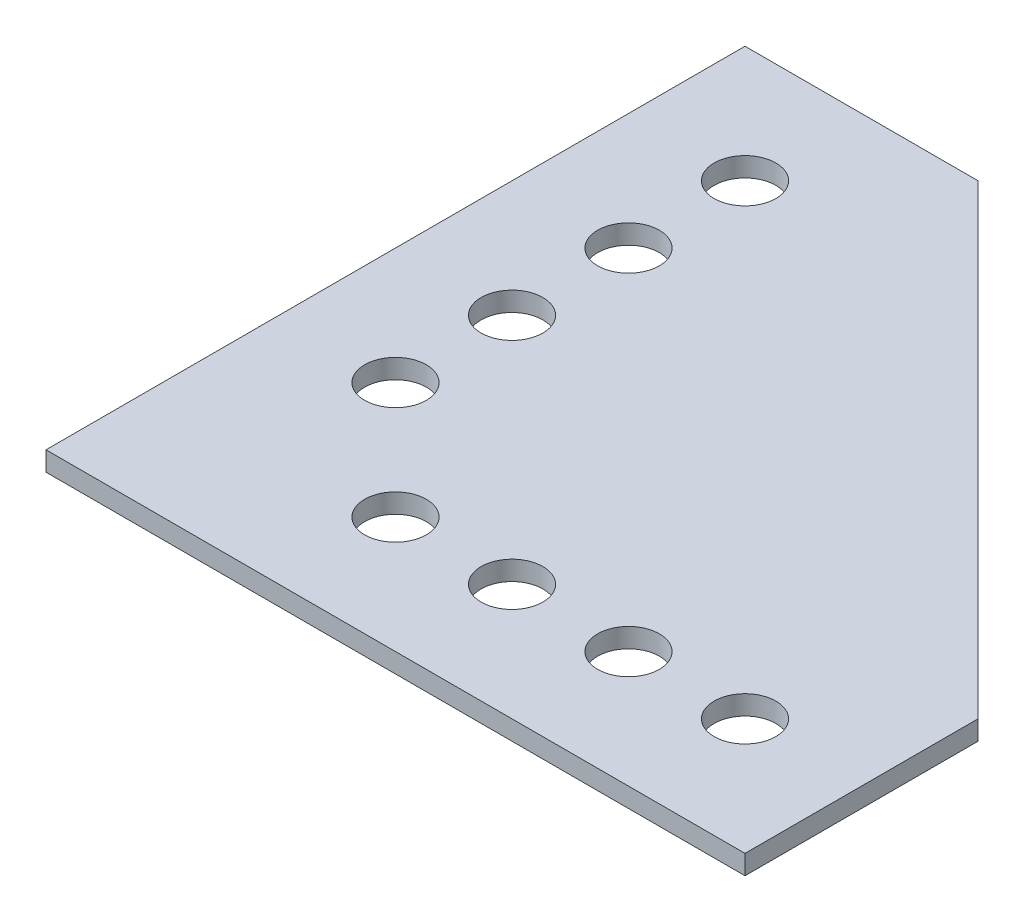
ISO-10303-21;
HEADER;
FILE_DESCRIPTION(('STEP AP214'),'2;1');
FILE_NAME('part.step','',(''),(''),'','','');
FILE_SCHEMA(('AUTOMOTIVE_DESIGN { 1 0 10303 214 1 1 1 1 }'));
ENDSEC;
DATA;
#1=APPLICATION_CONTEXT('core data for automotive mechanical design processes');
#2=APPLICATION_PROTOCOL_DEFINITION('international standard','automotive_design',2000,#1);
#3=PRODUCT_CONTEXT('',#1,'mechanical');
#4=PRODUCT('Part','Part','',(#3));
#5=PRODUCT_RELATED_PRODUCT_CATEGORY('part','',(#4));
#6=PRODUCT_DEFINITION_FORMATION('','',#4);
#7=PRODUCT_DEFINITION_CONTEXT('part definition',#1,'design');
#8=PRODUCT_DEFINITION('design','',#6,#7);
#9=PRODUCT_DEFINITION_SHAPE('','',#8);
#10=(LENGTH_UNIT() NAMED_UNIT(*) SI_UNIT(.MILLI.,.METRE.));
#11=(NAMED_UNIT(*) PLANE_ANGLE_UNIT() SI_UNIT($,.RADIAN.));
#12=(NAMED_UNIT(*) SI_UNIT($,.STERADIAN.) SOLID_ANGLE_UNIT());
#13=UNCERTAINTY_MEASURE_WITH_UNIT(LENGTH_MEASURE(1.E-05),#10,'distance_accuracy_value','');
#14=(GEOMETRIC_REPRESENTATION_CONTEXT(3) GLOBAL_UNCERTAINTY_ASSIGNED_CONTEXT((#13)) GLOBAL_UNIT_ASSIGNED_CONTEXT((#10,
#11,#12)) REPRESENTATION_CONTEXT('',''));
#15=CARTESIAN_POINT('',(0.,0.,0.));
#16=DIRECTION('',(0.,0.,1.));
#17=DIRECTION('',(1.,0.,0.));
#18=AXIS2_PLACEMENT_3D('',#15,#16,#17);
#19=CARTESIAN_POINT('',(0.,0.,0.));
#20=DIRECTION('',(0.,1.,0.));
#21=DIRECTION('',(0.,0.,1.));
#22=AXIS2_PLACEMENT_3D('',#19,#20,#21);
#23=PLANE('',#22);
#24=CARTESIAN_POINT('',(19.05,0.,38.1));
#25=DIRECTION('',(0.,1.,0.));
#26=DIRECTION('',(0.,0.,1.));
#27=AXIS2_PLACEMENT_3D('',#24,#25,#26);
#28=CIRCLE('',#27,5.0419);
#29=CARTESIAN_POINT('',(19.05,0.,43.1419));
#30=VERTEX_POINT('',#29);
#31=EDGE_CURVE('E189',#30,#30,#28,.F.);
#32=ORIENTED_EDGE('',*,*,#31,.F.);
#33=EDGE_LOOP('',(#32));
#34=FACE_BOUND('',#33,.T.);
#35=CARTESIAN_POINT('',(19.05,0.,57.15));
#36=DIRECTION('',(0.,1.,0.));
#37=DIRECTION('',(0.,0.,1.));
#38=AXIS2_PLACEMENT_3D('',#35,#36,#37);
#39=CIRCLE('',#38,5.0419);
#40=CARTESIAN_POINT('',(19.05,0.,62.1919));
#41=VERTEX_POINT('',#40);
#42=EDGE_CURVE('E195',#41,#41,#39,.F.);
#43=ORIENTED_EDGE('',*,*,#42,.F.);
#44=EDGE_LOOP('',(#43));
#45=FACE_BOUND('',#44,.T.);
#46=CARTESIAN_POINT('',(19.05,0.,76.2));
#47=DIRECTION('',(0.,1.,0.));
#48=DIRECTION('',(0.,0.,1.));
#49=AXIS2_PLACEMENT_3D('',#46,#47,#48);
#50=CIRCLE('',#49,5.0419);
#51=CARTESIAN_POINT('',(19.05,0.,81.2419));
#52=VERTEX_POINT('',#51);
#53=EDGE_CURVE('E201',#52,#52,#50,.F.);
#54=ORIENTED_EDGE('',*,*,#53,.F.);
#55=EDGE_LOOP('',(#54));
#56=FACE_BOUND('',#55,.T.);
#57=CARTESIAN_POINT('',(38.1,0.,95.25));
#58=DIRECTION('',(0.,1.,0.));
#59=DIRECTION('',(0.,0.,1.));
#60=AXIS2_PLACEMENT_3D('',#57,#58,#59);
#61=CIRCLE('',#60,5.0419);
#62=CARTESIAN_POINT('',(38.1,0.,100.2919));
#63=VERTEX_POINT('',#62);
#64=EDGE_CURVE('E207',#63,#63,#61,.F.);
#65=ORIENTED_EDGE('',*,*,#64,.F.);
#66=EDGE_LOOP('',(#65));
#67=FACE_BOUND('',#66,.T.);
#68=CARTESIAN_POINT('',(57.15,0.,95.25));
#69=DIRECTION('',(0.,1.,0.));
#70=DIRECTION('',(0.,0.,1.));
#71=AXIS2_PLACEMENT_3D('',#68,#69,#70);
#72=CIRCLE('',#71,5.0419);
#73=CARTESIAN_POINT('',(57.15,0.,100.2919));
#74=VERTEX_POINT('',#73);
#75=EDGE_CURVE('E213',#74,#74,#72,.F.);
#76=ORIENTED_EDGE('',*,*,#75,.F.);
#77=EDGE_LOOP('',(#76));
#78=FACE_BOUND('',#77,.T.);
#79=CARTESIAN_POINT('',(76.2,0.,95.25));
#80=DIRECTION('',(0.,1.,0.));
#81=DIRECTION('',(0.,0.,1.));
#82=AXIS2_PLACEMENT_3D('',#79,#80,#81);
#83=CIRCLE('',#82,5.0419);
#84=CARTESIAN_POINT('',(76.2,0.,100.2919));
#85=VERTEX_POINT('',#84);
#86=EDGE_CURVE('E219',#85,#85,#83,.F.);
#87=ORIENTED_EDGE('',*,*,#86,.F.);
#88=EDGE_LOOP('',(#87));
#89=FACE_BOUND('',#88,.T.);
#90=CARTESIAN_POINT('',(95.25,0.,95.25));
#91=DIRECTION('',(0.,1.,0.));
#92=DIRECTION('',(0.,0.,1.));
#93=AXIS2_PLACEMENT_3D('',#90,#91,#92);
#94=CIRCLE('',#93,5.0419);
#95=CARTESIAN_POINT('',(95.25,0.,100.2919));
#96=VERTEX_POINT('',#95);
#97=EDGE_CURVE('E112',#96,#96,#94,.F.);
#98=ORIENTED_EDGE('',*,*,#97,.F.);
#99=EDGE_LOOP('',(#98));
#100=FACE_BOUND('',#99,.T.);
#101=DIRECTION('',(0.,0.,1.));
#102=VECTOR('',#101,1.);
#103=CARTESIAN_POINT('',(0.,0.,0.));
#104=LINE('',#103,#102);
#105=CARTESIAN_POINT('',(0.,0.,0.));
#106=VERTEX_POINT('',#105);
#107=CARTESIAN_POINT('',(0.,0.,114.3));
#108=VERTEX_POINT('',#107);
#109=EDGE_CURVE('E108',#106,#108,#104,.T.);
#110=ORIENTED_EDGE('',*,*,#109,.F.);
#111=DIRECTION('',(-1.,0.,0.));
#112=VECTOR('',#111,1.);
#113=CARTESIAN_POINT('',(0.,0.,0.));
#114=LINE('',#113,#112);
#115=CARTESIAN_POINT('',(38.1,0.,0.));
#116=VERTEX_POINT('',#115);
#117=EDGE_CURVE('E76',#116,#106,#114,.T.);
#118=ORIENTED_EDGE('',*,*,#117,.F.);
#119=DIRECTION('',(-0.707106781186548,0.,-0.707106781186548));
#120=VECTOR('',#119,1.);
#121=CARTESIAN_POINT('',(114.3,0.,76.2));
#122=LINE('',#121,#120);
#123=CARTESIAN_POINT('',(114.3,0.,76.2));
#124=VERTEX_POINT('',#123);
#125=EDGE_CURVE('E70',#124,#116,#122,.T.);
#126=ORIENTED_EDGE('',*,*,#125,.F.);
#127=DIRECTION('',(0.,0.,-1.));
#128=VECTOR('',#127,1.);
#129=CARTESIAN_POINT('',(114.3,0.,114.3));
#130=LINE('',#129,#128);
#131=CARTESIAN_POINT('',(114.3,0.,114.3));
#132=VERTEX_POINT('',#131);
#133=EDGE_CURVE('E99',#132,#124,#130,.T.);
#134=ORIENTED_EDGE('',*,*,#133,.F.);
#135=DIRECTION('',(1.,0.,0.));
#136=VECTOR('',#135,1.);
#137=CARTESIAN_POINT('',(0.,0.,114.3));
#138=LINE('',#137,#136);
#139=EDGE_CURVE('E111',#108,#132,#138,.T.);
#140=ORIENTED_EDGE('',*,*,#139,.F.);
#141=EDGE_LOOP('',(#110,#118,#126,#134,#140));
#142=FACE_BOUND('',#141,.T.);
#143=CARTESIAN_POINT('',(19.05,0.,19.05));
#144=DIRECTION('',(0.,1.,0.));
#145=DIRECTION('',(0.,0.,1.));
#146=AXIS2_PLACEMENT_3D('',#143,#144,#145);
#147=CIRCLE('',#146,5.0419);
#148=CARTESIAN_POINT('',(19.05,0.,24.0919));
#149=VERTEX_POINT('',#148);
#150=EDGE_CURVE('E181',#149,#149,#147,.F.);
#151=ORIENTED_EDGE('',*,*,#150,.F.);
#152=EDGE_LOOP('',(#151));
#153=FACE_BOUND('',#152,.T.);
#154=ADVANCED_FACE('F33',(#34,#45,#56,#67,#78,#89,#100,#142,#153),#23,.F.);
#155=CARTESIAN_POINT('',(0.,3.175,0.));
#156=DIRECTION('',(1.,0.,0.));
#157=DIRECTION('',(0.,0.,-1.));
#158=AXIS2_PLACEMENT_3D('',#155,#156,#157);
#159=PLANE('',#158);
#160=ORIENTED_EDGE('',*,*,#109,.T.);
#161=DIRECTION('',(0.,-1.,0.));
#162=VECTOR('',#161,1.);
#163=CARTESIAN_POINT('',(0.,3.175,114.3));
#164=LINE('',#163,#162);
#165=CARTESIAN_POINT('',(0.,3.175,114.3));
#166=VERTEX_POINT('',#165);
#167=EDGE_CURVE('E11',#166,#108,#164,.T.);
#168=ORIENTED_EDGE('',*,*,#167,.F.);
#169=DIRECTION('',(0.,0.,1.));
#170=VECTOR('',#169,1.);
#171=CARTESIAN_POINT('',(0.,3.175,0.));
#172=LINE('',#171,#170);
#173=CARTESIAN_POINT('',(0.,3.175,0.));
#174=VERTEX_POINT('',#173);
#175=EDGE_CURVE('E117',#174,#166,#172,.T.);
#176=ORIENTED_EDGE('',*,*,#175,.F.);
#177=DIRECTION('',(0.,-1.,0.));
#178=VECTOR('',#177,1.);
#179=CARTESIAN_POINT('',(0.,3.175,0.));
#180=LINE('',#179,#178);
#181=EDGE_CURVE('E104',#174,#106,#180,.T.);
#182=ORIENTED_EDGE('',*,*,#181,.T.);
#183=EDGE_LOOP('',(#160,#168,#176,#182));
#184=FACE_BOUND('',#183,.T.);
#185=ADVANCED_FACE('F35',(#184),#159,.F.);
#186=CARTESIAN_POINT('',(0.,3.175,114.3));
#187=DIRECTION('',(0.,0.,-1.));
#188=DIRECTION('',(-1.,0.,0.));
#189=AXIS2_PLACEMENT_3D('',#186,#187,#188);
#190=PLANE('',#189);
#191=ORIENTED_EDGE('',*,*,#139,.T.);
#192=DIRECTION('',(0.,-1.,0.));
#193=VECTOR('',#192,1.);
#194=CARTESIAN_POINT('',(114.3,3.175,114.3));
#195=LINE('',#194,#193);
#196=CARTESIAN_POINT('',(114.3,3.175,114.3));
#197=VERTEX_POINT('',#196);
#198=EDGE_CURVE('E42',#197,#132,#195,.T.);
#199=ORIENTED_EDGE('',*,*,#198,.F.);
#200=DIRECTION('',(1.,0.,0.));
#201=VECTOR('',#200,1.);
#202=CARTESIAN_POINT('',(0.,3.175,114.3));
#203=LINE('',#202,#201);
#204=EDGE_CURVE('E84',#166,#197,#203,.T.);
#205=ORIENTED_EDGE('',*,*,#204,.F.);
#206=ORIENTED_EDGE('',*,*,#167,.T.);
#207=EDGE_LOOP('',(#191,#199,#205,#206));
#208=FACE_BOUND('',#207,.T.);
#209=ADVANCED_FACE('F142',(#208),#190,.F.);
#210=CARTESIAN_POINT('',(114.3,3.175,114.3));
#211=DIRECTION('',(-1.,0.,0.));
#212=DIRECTION('',(0.,0.,1.));
#213=AXIS2_PLACEMENT_3D('',#210,#211,#212);
#214=PLANE('',#213);
#215=ORIENTED_EDGE('',*,*,#133,.T.);
#216=DIRECTION('',(0.,-1.,0.));
#217=VECTOR('',#216,1.);
#218=CARTESIAN_POINT('',(114.3,3.175,76.2));
#219=LINE('',#218,#217);
#220=CARTESIAN_POINT('',(114.3,3.175,76.2));
#221=VERTEX_POINT('',#220);
#222=EDGE_CURVE('E96',#221,#124,#219,.T.);
#223=ORIENTED_EDGE('',*,*,#222,.F.);
#224=DIRECTION('',(0.,0.,-1.));
#225=VECTOR('',#224,1.);
#226=CARTESIAN_POINT('',(114.3,3.175,114.3));
#227=LINE('',#226,#225);
#228=EDGE_CURVE('E88',#197,#221,#227,.T.);
#229=ORIENTED_EDGE('',*,*,#228,.F.);
#230=ORIENTED_EDGE('',*,*,#198,.T.);
#231=EDGE_LOOP('',(#215,#223,#229,#230));
#232=FACE_BOUND('',#231,.T.);
#233=ADVANCED_FACE('F97',(#232),#214,.F.);
#234=CARTESIAN_POINT('',(114.3,3.175,76.2));
#235=DIRECTION('',(-0.707106781186548,0.,0.707106781186548));
#236=DIRECTION('',(0.707106781186548,0.,0.707106781186548));
#237=AXIS2_PLACEMENT_3D('',#234,#235,#236);
#238=PLANE('',#237);
#239=ORIENTED_EDGE('',*,*,#125,.T.);
#240=DIRECTION('',(0.,-1.,0.));
#241=VECTOR('',#240,1.);
#242=CARTESIAN_POINT('',(38.1,3.175,0.));
#243=LINE('',#242,#241);
#244=CARTESIAN_POINT('',(38.1,3.175,0.));
#245=VERTEX_POINT('',#244);
#246=EDGE_CURVE('E100',#245,#116,#243,.T.);
#247=ORIENTED_EDGE('',*,*,#246,.F.);
#248=DIRECTION('',(-0.707106781186548,0.,-0.707106781186548));
#249=VECTOR('',#248,1.);
#250=CARTESIAN_POINT('',(114.3,3.175,76.2));
#251=LINE('',#250,#249);
#252=EDGE_CURVE('E92',#221,#245,#251,.T.);
#253=ORIENTED_EDGE('',*,*,#252,.F.);
#254=ORIENTED_EDGE('',*,*,#222,.T.);
#255=EDGE_LOOP('',(#239,#247,#253,#254));
#256=FACE_BOUND('',#255,.T.);
#257=ADVANCED_FACE('F102',(#256),#238,.F.);
#258=CARTESIAN_POINT('',(0.,3.175,0.));
#259=DIRECTION('',(0.,0.,1.));
#260=DIRECTION('',(1.,0.,0.));
#261=AXIS2_PLACEMENT_3D('',#258,#259,#260);
#262=PLANE('',#261);
#263=ORIENTED_EDGE('',*,*,#117,.T.);
#264=ORIENTED_EDGE('',*,*,#181,.F.);
#265=DIRECTION('',(-1.,0.,0.));
#266=VECTOR('',#265,1.);
#267=CARTESIAN_POINT('',(0.,3.175,0.));
#268=LINE('',#267,#266);
#269=EDGE_CURVE('E50',#245,#174,#268,.T.);
#270=ORIENTED_EDGE('',*,*,#269,.F.);
#271=ORIENTED_EDGE('',*,*,#246,.T.);
#272=EDGE_LOOP('',(#263,#264,#270,#271));
#273=FACE_BOUND('',#272,.T.);
#274=ADVANCED_FACE('F125',(#273),#262,.F.);
#275=CARTESIAN_POINT('',(0.,3.175,0.));
#276=DIRECTION('',(0.,1.,0.));
#277=DIRECTION('',(0.,0.,1.));
#278=AXIS2_PLACEMENT_3D('',#275,#276,#277);
#279=PLANE('',#278);
#280=CARTESIAN_POINT('',(19.05,3.175,19.05));
#281=DIRECTION('',(0.,1.,0.));
#282=DIRECTION('',(0.,0.,1.));
#283=AXIS2_PLACEMENT_3D('',#280,#281,#282);
#284=CIRCLE('',#283,5.0419);
#285=CARTESIAN_POINT('',(19.05,3.175,24.0919));
#286=VERTEX_POINT('',#285);
#287=EDGE_CURVE('E184',#286,#286,#284,.T.);
#288=ORIENTED_EDGE('',*,*,#287,.F.);
#289=EDGE_LOOP('',(#288));
#290=FACE_BOUND('',#289,.T.);
#291=CARTESIAN_POINT('',(19.05,3.175,38.1));
#292=DIRECTION('',(0.,1.,0.));
#293=DIRECTION('',(0.,0.,1.));
#294=AXIS2_PLACEMENT_3D('',#291,#292,#293);
#295=CIRCLE('',#294,5.0419);
#296=CARTESIAN_POINT('',(19.05,3.175,43.1419));
#297=VERTEX_POINT('',#296);
#298=EDGE_CURVE('E186',#297,#297,#295,.T.);
#299=ORIENTED_EDGE('',*,*,#298,.F.);
#300=EDGE_LOOP('',(#299));
#301=FACE_BOUND('',#300,.T.);
#302=CARTESIAN_POINT('',(19.05,3.175,57.15));
#303=DIRECTION('',(0.,1.,0.));
#304=DIRECTION('',(0.,0.,1.));
#305=AXIS2_PLACEMENT_3D('',#302,#303,#304);
#306=CIRCLE('',#305,5.0419);
#307=CARTESIAN_POINT('',(19.05,3.175,62.1919));
#308=VERTEX_POINT('',#307);
#309=EDGE_CURVE('E192',#308,#308,#306,.T.);
#310=ORIENTED_EDGE('',*,*,#309,.F.);
#311=EDGE_LOOP('',(#310));
#312=FACE_BOUND('',#311,.T.);
#313=CARTESIAN_POINT('',(19.05,3.175,76.2));
#314=DIRECTION('',(0.,1.,0.));
#315=DIRECTION('',(0.,0.,1.));
#316=AXIS2_PLACEMENT_3D('',#313,#314,#315);
#317=CIRCLE('',#316,5.0419);
#318=CARTESIAN_POINT('',(19.05,3.175,81.2419));
#319=VERTEX_POINT('',#318);
#320=EDGE_CURVE('E198',#319,#319,#317,.T.);
#321=ORIENTED_EDGE('',*,*,#320,.F.);
#322=EDGE_LOOP('',(#321));
#323=FACE_BOUND('',#322,.T.);
#324=CARTESIAN_POINT('',(38.1,3.175,95.25));
#325=DIRECTION('',(0.,1.,0.));
#326=DIRECTION('',(0.,0.,1.));
#327=AXIS2_PLACEMENT_3D('',#324,#325,#326);
#328=CIRCLE('',#327,5.04189999999999);
#329=CARTESIAN_POINT('',(38.1,3.175,100.2919));
#330=VERTEX_POINT('',#329);
#331=EDGE_CURVE('E204',#330,#330,#328,.T.);
#332=ORIENTED_EDGE('',*,*,#331,.F.);
#333=EDGE_LOOP('',(#332));
#334=FACE_BOUND('',#333,.T.);
#335=CARTESIAN_POINT('',(57.15,3.175,95.25));
#336=DIRECTION('',(0.,1.,0.));
#337=DIRECTION('',(0.,0.,1.));
#338=AXIS2_PLACEMENT_3D('',#335,#336,#337);
#339=CIRCLE('',#338,5.04189999999999);
#340=CARTESIAN_POINT('',(57.15,3.175,100.2919));
#341=VERTEX_POINT('',#340);
#342=EDGE_CURVE('E210',#341,#341,#339,.T.);
#343=ORIENTED_EDGE('',*,*,#342,.F.);
#344=EDGE_LOOP('',(#343));
#345=FACE_BOUND('',#344,.T.);
#346=CARTESIAN_POINT('',(76.2,3.175,95.25));
#347=DIRECTION('',(0.,1.,0.));
#348=DIRECTION('',(0.,0.,1.));
#349=AXIS2_PLACEMENT_3D('',#346,#347,#348);
#350=CIRCLE('',#349,5.0419);
#351=CARTESIAN_POINT('',(76.2,3.175,100.2919));
#352=VERTEX_POINT('',#351);
#353=EDGE_CURVE('E216',#352,#352,#350,.T.);
#354=ORIENTED_EDGE('',*,*,#353,.F.);
#355=EDGE_LOOP('',(#354));
#356=FACE_BOUND('',#355,.T.);
#357=CARTESIAN_POINT('',(95.25,3.175,95.25));
#358=DIRECTION('',(0.,1.,0.));
#359=DIRECTION('',(0.,0.,1.));
#360=AXIS2_PLACEMENT_3D('',#357,#358,#359);
#361=CIRCLE('',#360,5.0419);
#362=CARTESIAN_POINT('',(95.25,3.175,100.2919));
#363=VERTEX_POINT('',#362);
#364=EDGE_CURVE('E222',#363,#363,#361,.T.);
#365=ORIENTED_EDGE('',*,*,#364,.F.);
#366=EDGE_LOOP('',(#365));
#367=FACE_BOUND('',#366,.T.);
#368=ORIENTED_EDGE('',*,*,#175,.T.);
#369=ORIENTED_EDGE('',*,*,#204,.T.);
#370=ORIENTED_EDGE('',*,*,#228,.T.);
#371=ORIENTED_EDGE('',*,*,#252,.T.);
#372=ORIENTED_EDGE('',*,*,#269,.T.);
#373=EDGE_LOOP('',(#368,#369,#370,#371,#372));
#374=FACE_BOUND('',#373,.T.);
#375=ADVANCED_FACE('F90',(#290,#301,#312,#323,#334,#345,#356,#367,#374),#279,.T.);
#376=CARTESIAN_POINT('',(95.25,3.175,95.25));
#377=DIRECTION('',(0.,1.,0.));
#378=DIRECTION('',(0.,0.,1.));
#379=AXIS2_PLACEMENT_3D('',#376,#377,#378);
#380=CYLINDRICAL_SURFACE('',#379,5.0419);
#381=ORIENTED_EDGE('',*,*,#97,.T.);
#382=EDGE_LOOP('',(#381));
#383=FACE_BOUND('',#382,.T.);
#384=ORIENTED_EDGE('',*,*,#364,.T.);
#385=EDGE_LOOP('',(#384));
#386=FACE_BOUND('',#385,.T.);
#387=ADVANCED_FACE('F132',(#383,#386),#380,.F.);
#388=CARTESIAN_POINT('',(76.2,3.175,95.25));
#389=DIRECTION('',(0.,1.,0.));
#390=DIRECTION('',(0.,0.,1.));
#391=AXIS2_PLACEMENT_3D('',#388,#389,#390);
#392=CYLINDRICAL_SURFACE('',#391,5.0419);
#393=ORIENTED_EDGE('',*,*,#86,.T.);
#394=EDGE_LOOP('',(#393));
#395=FACE_BOUND('',#394,.T.);
#396=ORIENTED_EDGE('',*,*,#353,.T.);
#397=EDGE_LOOP('',(#396));
#398=FACE_BOUND('',#397,.T.);
#399=ADVANCED_FACE('F148',(#395,#398),#392,.F.);
#400=CARTESIAN_POINT('',(57.15,3.175,95.25));
#401=DIRECTION('',(0.,1.,0.));
#402=DIRECTION('',(0.,0.,1.));
#403=AXIS2_PLACEMENT_3D('',#400,#401,#402);
#404=CYLINDRICAL_SURFACE('',#403,5.0419);
#405=ORIENTED_EDGE('',*,*,#75,.T.);
#406=EDGE_LOOP('',(#405));
#407=FACE_BOUND('',#406,.T.);
#408=ORIENTED_EDGE('',*,*,#342,.T.);
#409=EDGE_LOOP('',(#408));
#410=FACE_BOUND('',#409,.T.);
#411=ADVANCED_FACE('F152',(#407,#410),#404,.F.);
#412=CARTESIAN_POINT('',(38.1,3.175,95.25));
#413=DIRECTION('',(0.,1.,0.));
#414=DIRECTION('',(0.,0.,1.));
#415=AXIS2_PLACEMENT_3D('',#412,#413,#414);
#416=CYLINDRICAL_SURFACE('',#415,5.0419);
#417=ORIENTED_EDGE('',*,*,#64,.T.);
#418=EDGE_LOOP('',(#417));
#419=FACE_BOUND('',#418,.T.);
#420=ORIENTED_EDGE('',*,*,#331,.T.);
#421=EDGE_LOOP('',(#420));
#422=FACE_BOUND('',#421,.T.);
#423=ADVANCED_FACE('F156',(#419,#422),#416,.F.);
#424=CARTESIAN_POINT('',(19.05,3.175,76.2));
#425=DIRECTION('',(0.,1.,0.));
#426=DIRECTION('',(0.,0.,1.));
#427=AXIS2_PLACEMENT_3D('',#424,#425,#426);
#428=CYLINDRICAL_SURFACE('',#427,5.0419);
#429=ORIENTED_EDGE('',*,*,#53,.T.);
#430=EDGE_LOOP('',(#429));
#431=FACE_BOUND('',#430,.T.);
#432=ORIENTED_EDGE('',*,*,#320,.T.);
#433=EDGE_LOOP('',(#432));
#434=FACE_BOUND('',#433,.T.);
#435=ADVANCED_FACE('F160',(#431,#434),#428,.F.);
#436=CARTESIAN_POINT('',(19.05,3.175,57.15));
#437=DIRECTION('',(0.,1.,0.));
#438=DIRECTION('',(0.,0.,1.));
#439=AXIS2_PLACEMENT_3D('',#436,#437,#438);
#440=CYLINDRICAL_SURFACE('',#439,5.0419);
#441=ORIENTED_EDGE('',*,*,#42,.T.);
#442=EDGE_LOOP('',(#441));
#443=FACE_BOUND('',#442,.T.);
#444=ORIENTED_EDGE('',*,*,#309,.T.);
#445=EDGE_LOOP('',(#444));
#446=FACE_BOUND('',#445,.T.);
#447=ADVANCED_FACE('F164',(#443,#446),#440,.F.);
#448=CARTESIAN_POINT('',(19.05,3.175,38.1));
#449=DIRECTION('',(0.,1.,0.));
#450=DIRECTION('',(0.,0.,1.));
#451=AXIS2_PLACEMENT_3D('',#448,#449,#450);
#452=CYLINDRICAL_SURFACE('',#451,5.0419);
#453=ORIENTED_EDGE('',*,*,#31,.T.);
#454=EDGE_LOOP('',(#453));
#455=FACE_BOUND('',#454,.T.);
#456=ORIENTED_EDGE('',*,*,#298,.T.);
#457=EDGE_LOOP('',(#456));
#458=FACE_BOUND('',#457,.T.);
#459=ADVANCED_FACE('F168',(#455,#458),#452,.F.);
#460=CARTESIAN_POINT('',(19.05,3.175,19.05));
#461=DIRECTION('',(0.,1.,0.));
#462=DIRECTION('',(0.,0.,1.));
#463=AXIS2_PLACEMENT_3D('',#460,#461,#462);
#464=CYLINDRICAL_SURFACE('',#463,5.0419);
#465=ORIENTED_EDGE('',*,*,#150,.T.);
#466=EDGE_LOOP('',(#465));
#467=FACE_BOUND('',#466,.T.);
#468=ORIENTED_EDGE('',*,*,#287,.T.);
#469=EDGE_LOOP('',(#468));
#470=FACE_BOUND('',#469,.T.);
#471=ADVANCED_FACE('F172',(#467,#470),#464,.F.);
#472=CLOSED_SHELL('',(#154,#185,#209,#233,#257,#274,#375,#387,#399,#411,#423,#435,#447,#459,#471));
#473=MANIFOLD_SOLID_BREP('B2',#472);
#474=ADVANCED_BREP_SHAPE_REPRESENTATION('',(#18,#473),#14);
#475=SHAPE_DEFINITION_REPRESENTATION(#9,#474);
ENDSEC;
END-ISO-10303-21;
